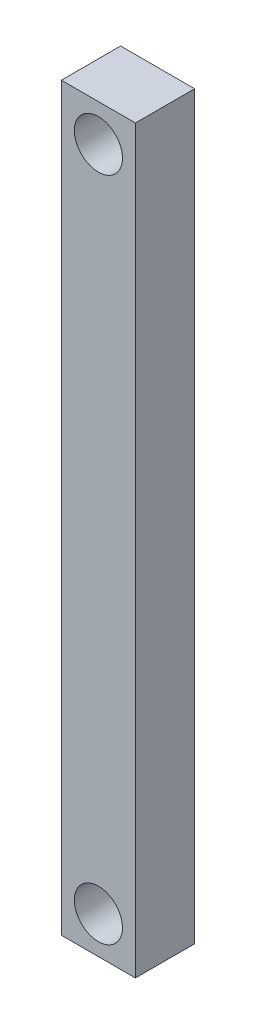
ISO-10303-21;
HEADER;
FILE_DESCRIPTION(('STEP AP214'),'2;1');
FILE_NAME('part.step','',(''),(''),'','','');
FILE_SCHEMA(('AUTOMOTIVE_DESIGN { 1 0 10303 214 1 1 1 1 }'));
ENDSEC;
DATA;
#1=APPLICATION_CONTEXT('core data for automotive mechanical design processes');
#2=APPLICATION_PROTOCOL_DEFINITION('international standard','automotive_design',2000,#1);
#3=PRODUCT_CONTEXT('',#1,'mechanical');
#4=PRODUCT('Part','Part','',(#3));
#5=PRODUCT_RELATED_PRODUCT_CATEGORY('part','',(#4));
#6=PRODUCT_DEFINITION_FORMATION('','',#4);
#7=PRODUCT_DEFINITION_CONTEXT('part definition',#1,'design');
#8=PRODUCT_DEFINITION('design','',#6,#7);
#9=PRODUCT_DEFINITION_SHAPE('','',#8);
#10=(LENGTH_UNIT() NAMED_UNIT(*) SI_UNIT(.MILLI.,.METRE.));
#11=(NAMED_UNIT(*) PLANE_ANGLE_UNIT() SI_UNIT($,.RADIAN.));
#12=(NAMED_UNIT(*) SI_UNIT($,.STERADIAN.) SOLID_ANGLE_UNIT());
#13=UNCERTAINTY_MEASURE_WITH_UNIT(LENGTH_MEASURE(1.E-05),#10,'distance_accuracy_value','');
#14=(GEOMETRIC_REPRESENTATION_CONTEXT(3) GLOBAL_UNCERTAINTY_ASSIGNED_CONTEXT((#13)) GLOBAL_UNIT_ASSIGNED_CONTEXT((#10,
#11,#12)) REPRESENTATION_CONTEXT('',''));
#15=CARTESIAN_POINT('',(0.,0.,0.));
#16=DIRECTION('',(0.,0.,1.));
#17=DIRECTION('',(1.,0.,0.));
#18=AXIS2_PLACEMENT_3D('',#15,#16,#17);
#19=CARTESIAN_POINT('',(0.,0.,4.));
#20=DIRECTION('',(0.,0.,-1.));
#21=DIRECTION('',(-1.,0.,0.));
#22=AXIS2_PLACEMENT_3D('',#19,#20,#21);
#23=PLANE('',#22);
#24=DIRECTION('',(0.,1.,0.));
#25=VECTOR('',#24,1.);
#26=CARTESIAN_POINT('',(2.5,-25.,4.));
#27=LINE('',#26,#25);
#28=CARTESIAN_POINT('',(2.5,-25.,4.));
#29=VERTEX_POINT('',#28);
#30=CARTESIAN_POINT('',(2.5,25.,4.));
#31=VERTEX_POINT('',#30);
#32=EDGE_CURVE('E85',#29,#31,#27,.T.);
#33=ORIENTED_EDGE('',*,*,#32,.T.);
#34=DIRECTION('',(-1.,0.,0.));
#35=VECTOR('',#34,1.);
#36=CARTESIAN_POINT('',(-2.5,25.,4.));
#37=LINE('',#36,#35);
#38=CARTESIAN_POINT('',(-2.5,25.,4.));
#39=VERTEX_POINT('',#38);
#40=EDGE_CURVE('E80',#31,#39,#37,.T.);
#41=ORIENTED_EDGE('',*,*,#40,.T.);
#42=DIRECTION('',(0.,-1.,0.));
#43=VECTOR('',#42,1.);
#44=CARTESIAN_POINT('',(-2.5,-25.,4.));
#45=LINE('',#44,#43);
#46=CARTESIAN_POINT('',(-2.5,-25.,4.));
#47=VERTEX_POINT('',#46);
#48=EDGE_CURVE('E83',#39,#47,#45,.T.);
#49=ORIENTED_EDGE('',*,*,#48,.T.);
#50=DIRECTION('',(1.,0.,0.));
#51=VECTOR('',#50,1.);
#52=CARTESIAN_POINT('',(-2.5,-25.,4.));
#53=LINE('',#52,#51);
#54=EDGE_CURVE('E50',#47,#29,#53,.T.);
#55=ORIENTED_EDGE('',*,*,#54,.T.);
#56=EDGE_LOOP('',(#33,#41,#49,#55));
#57=FACE_BOUND('',#56,.T.);
#58=CARTESIAN_POINT('',(0.,22.5,4.));
#59=DIRECTION('',(0.,0.,1.));
#60=DIRECTION('',(1.,0.,0.));
#61=AXIS2_PLACEMENT_3D('',#58,#59,#60);
#62=CIRCLE('',#61,1.625);
#63=CARTESIAN_POINT('',(1.625,22.5,4.));
#64=VERTEX_POINT('',#63);
#65=EDGE_CURVE('E100',#64,#64,#62,.T.);
#66=ORIENTED_EDGE('',*,*,#65,.F.);
#67=EDGE_LOOP('',(#66));
#68=FACE_BOUND('',#67,.T.);
#69=CARTESIAN_POINT('',(0.,-22.5,4.));
#70=DIRECTION('',(0.,0.,1.));
#71=DIRECTION('',(-1.,0.,0.));
#72=AXIS2_PLACEMENT_3D('',#69,#70,#71);
#73=CIRCLE('',#72,1.625);
#74=CARTESIAN_POINT('',(-1.625,-22.5,4.));
#75=VERTEX_POINT('',#74);
#76=EDGE_CURVE('E115',#75,#75,#73,.T.);
#77=ORIENTED_EDGE('',*,*,#76,.F.);
#78=EDGE_LOOP('',(#77));
#79=FACE_BOUND('',#78,.T.);
#80=ADVANCED_FACE('F33',(#57,#68,#79),#23,.F.);
#81=CARTESIAN_POINT('',(0.,0.,0.));
#82=DIRECTION('',(0.,0.,-1.));
#83=DIRECTION('',(-1.,0.,0.));
#84=AXIS2_PLACEMENT_3D('',#81,#82,#83);
#85=PLANE('',#84);
#86=CARTESIAN_POINT('',(0.,22.5,0.));
#87=DIRECTION('',(0.,0.,1.));
#88=DIRECTION('',(1.,0.,0.));
#89=AXIS2_PLACEMENT_3D('',#86,#87,#88);
#90=CIRCLE('',#89,1.625);
#91=CARTESIAN_POINT('',(1.625,22.5,0.));
#92=VERTEX_POINT('',#91);
#93=EDGE_CURVE('E112',#92,#92,#90,.T.);
#94=ORIENTED_EDGE('',*,*,#93,.T.);
#95=EDGE_LOOP('',(#94));
#96=FACE_BOUND('',#95,.T.);
#97=DIRECTION('',(0.,1.,0.));
#98=VECTOR('',#97,1.);
#99=CARTESIAN_POINT('',(2.5,-25.,0.));
#100=LINE('',#99,#98);
#101=CARTESIAN_POINT('',(2.5,-25.,0.));
#102=VERTEX_POINT('',#101);
#103=CARTESIAN_POINT('',(2.5,25.,0.));
#104=VERTEX_POINT('',#103);
#105=EDGE_CURVE('E97',#102,#104,#100,.T.);
#106=ORIENTED_EDGE('',*,*,#105,.F.);
#107=DIRECTION('',(1.,0.,0.));
#108=VECTOR('',#107,1.);
#109=CARTESIAN_POINT('',(-2.5,-25.,0.));
#110=LINE('',#109,#108);
#111=CARTESIAN_POINT('',(-2.5,-25.,0.));
#112=VERTEX_POINT('',#111);
#113=EDGE_CURVE('E73',#112,#102,#110,.T.);
#114=ORIENTED_EDGE('',*,*,#113,.F.);
#115=DIRECTION('',(0.,-1.,0.));
#116=VECTOR('',#115,1.);
#117=CARTESIAN_POINT('',(-2.5,-25.,0.));
#118=LINE('',#117,#116);
#119=CARTESIAN_POINT('',(-2.5,25.,0.));
#120=VERTEX_POINT('',#119);
#121=EDGE_CURVE('E67',#120,#112,#118,.T.);
#122=ORIENTED_EDGE('',*,*,#121,.F.);
#123=DIRECTION('',(-1.,0.,0.));
#124=VECTOR('',#123,1.);
#125=CARTESIAN_POINT('',(-2.5,25.,0.));
#126=LINE('',#125,#124);
#127=EDGE_CURVE('E89',#104,#120,#126,.T.);
#128=ORIENTED_EDGE('',*,*,#127,.F.);
#129=EDGE_LOOP('',(#106,#114,#122,#128));
#130=FACE_BOUND('',#129,.T.);
#131=CARTESIAN_POINT('',(0.,-22.5,0.));
#132=DIRECTION('',(0.,0.,1.));
#133=DIRECTION('',(-1.,0.,0.));
#134=AXIS2_PLACEMENT_3D('',#131,#132,#133);
#135=CIRCLE('',#134,1.625);
#136=CARTESIAN_POINT('',(-1.625,-22.5,0.));
#137=VERTEX_POINT('',#136);
#138=EDGE_CURVE('E118',#137,#137,#135,.T.);
#139=ORIENTED_EDGE('',*,*,#138,.T.);
#140=EDGE_LOOP('',(#139));
#141=FACE_BOUND('',#140,.T.);
#142=ADVANCED_FACE('F108',(#96,#130,#141),#85,.T.);
#143=CARTESIAN_POINT('',(2.5,-25.,4.));
#144=DIRECTION('',(-1.,0.,0.));
#145=DIRECTION('',(0.,0.,1.));
#146=AXIS2_PLACEMENT_3D('',#143,#144,#145);
#147=PLANE('',#146);
#148=ORIENTED_EDGE('',*,*,#105,.T.);
#149=DIRECTION('',(0.,0.,-1.));
#150=VECTOR('',#149,1.);
#151=CARTESIAN_POINT('',(2.5,25.,4.));
#152=LINE('',#151,#150);
#153=EDGE_CURVE('E11',#31,#104,#152,.T.);
#154=ORIENTED_EDGE('',*,*,#153,.F.);
#155=ORIENTED_EDGE('',*,*,#32,.F.);
#156=DIRECTION('',(0.,0.,-1.));
#157=VECTOR('',#156,1.);
#158=CARTESIAN_POINT('',(2.5,-25.,4.));
#159=LINE('',#158,#157);
#160=EDGE_CURVE('E93',#29,#102,#159,.T.);
#161=ORIENTED_EDGE('',*,*,#160,.T.);
#162=EDGE_LOOP('',(#148,#154,#155,#161));
#163=FACE_BOUND('',#162,.T.);
#164=ADVANCED_FACE('F35',(#163),#147,.F.);
#165=CARTESIAN_POINT('',(-2.5,25.,4.));
#166=DIRECTION('',(0.,-1.,0.));
#167=DIRECTION('',(0.,0.,-1.));
#168=AXIS2_PLACEMENT_3D('',#165,#166,#167);
#169=PLANE('',#168);
#170=ORIENTED_EDGE('',*,*,#127,.T.);
#171=DIRECTION('',(0.,0.,-1.));
#172=VECTOR('',#171,1.);
#173=CARTESIAN_POINT('',(-2.5,25.,4.));
#174=LINE('',#173,#172);
#175=EDGE_CURVE('E42',#39,#120,#174,.T.);
#176=ORIENTED_EDGE('',*,*,#175,.F.);
#177=ORIENTED_EDGE('',*,*,#40,.F.);
#178=ORIENTED_EDGE('',*,*,#153,.T.);
#179=EDGE_LOOP('',(#170,#176,#177,#178));
#180=FACE_BOUND('',#179,.T.);
#181=ADVANCED_FACE('F88',(#180),#169,.F.);
#182=CARTESIAN_POINT('',(-2.5,-25.,4.));
#183=DIRECTION('',(1.,0.,0.));
#184=DIRECTION('',(0.,0.,-1.));
#185=AXIS2_PLACEMENT_3D('',#182,#183,#184);
#186=PLANE('',#185);
#187=ORIENTED_EDGE('',*,*,#121,.T.);
#188=DIRECTION('',(0.,0.,-1.));
#189=VECTOR('',#188,1.);
#190=CARTESIAN_POINT('',(-2.5,-25.,4.));
#191=LINE('',#190,#189);
#192=EDGE_CURVE('E90',#47,#112,#191,.T.);
#193=ORIENTED_EDGE('',*,*,#192,.F.);
#194=ORIENTED_EDGE('',*,*,#48,.F.);
#195=ORIENTED_EDGE('',*,*,#175,.T.);
#196=EDGE_LOOP('',(#187,#193,#194,#195));
#197=FACE_BOUND('',#196,.T.);
#198=ADVANCED_FACE('F91',(#197),#186,.F.);
#199=CARTESIAN_POINT('',(-2.5,-25.,4.));
#200=DIRECTION('',(0.,1.,0.));
#201=DIRECTION('',(0.,0.,1.));
#202=AXIS2_PLACEMENT_3D('',#199,#200,#201);
#203=PLANE('',#202);
#204=ORIENTED_EDGE('',*,*,#113,.T.);
#205=ORIENTED_EDGE('',*,*,#160,.F.);
#206=ORIENTED_EDGE('',*,*,#54,.F.);
#207=ORIENTED_EDGE('',*,*,#192,.T.);
#208=EDGE_LOOP('',(#204,#205,#206,#207));
#209=FACE_BOUND('',#208,.T.);
#210=ADVANCED_FACE('F105',(#209),#203,.F.);
#211=CARTESIAN_POINT('',(0.,22.5,4.));
#212=DIRECTION('',(0.,0.,-1.));
#213=DIRECTION('',(-1.,0.,0.));
#214=AXIS2_PLACEMENT_3D('',#211,#212,#213);
#215=CYLINDRICAL_SURFACE('',#214,1.625);
#216=ORIENTED_EDGE('',*,*,#65,.T.);
#217=EDGE_LOOP('',(#216));
#218=FACE_BOUND('',#217,.T.);
#219=ORIENTED_EDGE('',*,*,#93,.F.);
#220=EDGE_LOOP('',(#219));
#221=FACE_BOUND('',#220,.T.);
#222=ADVANCED_FACE('F135',(#218,#221),#215,.F.);
#223=CARTESIAN_POINT('',(0.,-22.5,4.));
#224=DIRECTION('',(0.,0.,-1.));
#225=DIRECTION('',(-1.,0.,0.));
#226=AXIS2_PLACEMENT_3D('',#223,#224,#225);
#227=CYLINDRICAL_SURFACE('',#226,1.625);
#228=ORIENTED_EDGE('',*,*,#76,.T.);
#229=EDGE_LOOP('',(#228));
#230=FACE_BOUND('',#229,.T.);
#231=ORIENTED_EDGE('',*,*,#138,.F.);
#232=EDGE_LOOP('',(#231));
#233=FACE_BOUND('',#232,.T.);
#234=ADVANCED_FACE('F124',(#230,#233),#227,.F.);
#235=CLOSED_SHELL('',(#80,#142,#164,#181,#198,#210,#222,#234));
#236=MANIFOLD_SOLID_BREP('B2',#235);
#237=ADVANCED_BREP_SHAPE_REPRESENTATION('',(#18,#236),#14);
#238=SHAPE_DEFINITION_REPRESENTATION(#9,#237);
ENDSEC;
END-ISO-10303-21;
